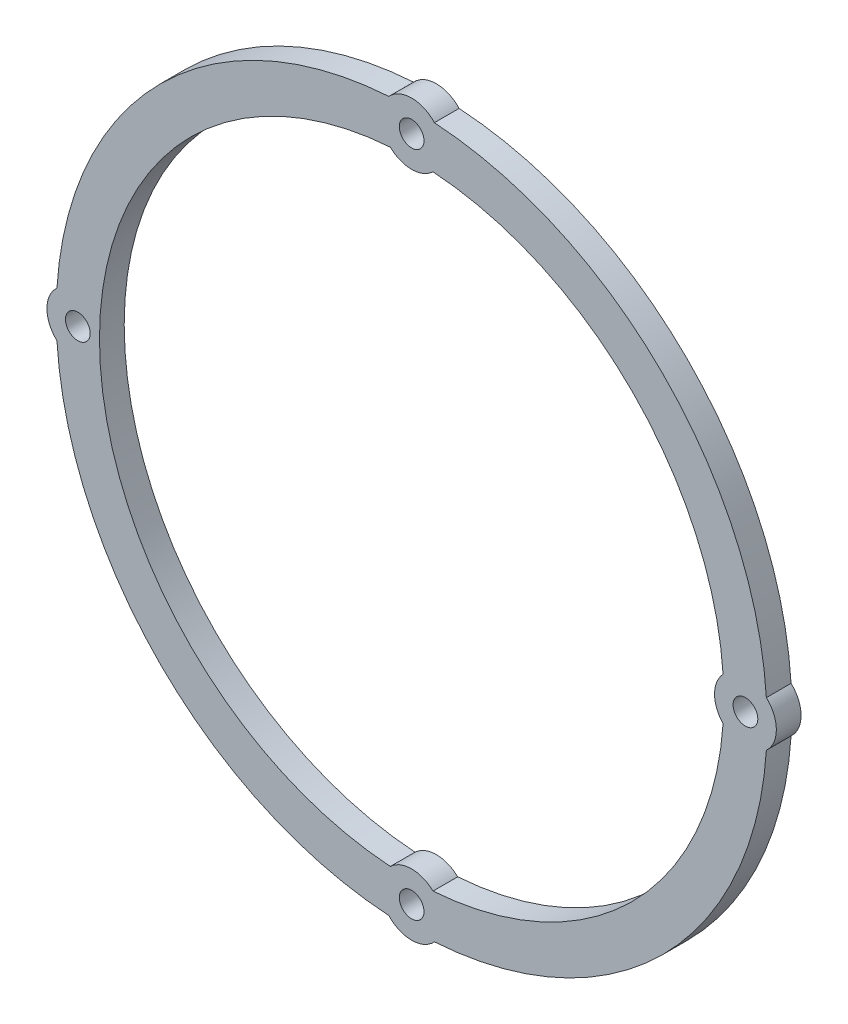
ISO-10303-21;
HEADER;
FILE_DESCRIPTION(('STEP AP214'),'2;1');
FILE_NAME('part.step','',(''),(''),'','','');
FILE_SCHEMA(('AUTOMOTIVE_DESIGN { 1 0 10303 214 1 1 1 1 }'));
ENDSEC;
DATA;
#1=APPLICATION_CONTEXT('core data for automotive mechanical design processes');
#2=APPLICATION_PROTOCOL_DEFINITION('international standard','automotive_design',2000,#1);
#3=PRODUCT_CONTEXT('',#1,'mechanical');
#4=PRODUCT('Part','Part','',(#3));
#5=PRODUCT_RELATED_PRODUCT_CATEGORY('part','',(#4));
#6=PRODUCT_DEFINITION_FORMATION('','',#4);
#7=PRODUCT_DEFINITION_CONTEXT('part definition',#1,'design');
#8=PRODUCT_DEFINITION('design','',#6,#7);
#9=PRODUCT_DEFINITION_SHAPE('','',#8);
#10=(LENGTH_UNIT() NAMED_UNIT(*) SI_UNIT(.MILLI.,.METRE.));
#11=(NAMED_UNIT(*) PLANE_ANGLE_UNIT() SI_UNIT($,.RADIAN.));
#12=(NAMED_UNIT(*) SI_UNIT($,.STERADIAN.) SOLID_ANGLE_UNIT());
#13=UNCERTAINTY_MEASURE_WITH_UNIT(LENGTH_MEASURE(1.E-05),#10,'distance_accuracy_value','');
#14=(GEOMETRIC_REPRESENTATION_CONTEXT(3) GLOBAL_UNCERTAINTY_ASSIGNED_CONTEXT((#13)) GLOBAL_UNIT_ASSIGNED_CONTEXT((#10,
#11,#12)) REPRESENTATION_CONTEXT('',''));
#15=CARTESIAN_POINT('',(0.,0.,0.));
#16=DIRECTION('',(0.,0.,1.));
#17=DIRECTION('',(1.,0.,0.));
#18=AXIS2_PLACEMENT_3D('',#15,#16,#17);
#19=CARTESIAN_POINT('',(54.0000000000002,0.,4.));
#20=DIRECTION('',(0.,0.,-1.));
#21=DIRECTION('',(-1.,0.,0.));
#22=AXIS2_PLACEMENT_3D('',#19,#20,#21);
#23=CYLINDRICAL_SURFACE('',#22,2.0000000000001);
#24=CARTESIAN_POINT('',(54.0000000000002,0.,4.));
#25=DIRECTION('',(0.,0.,1.));
#26=DIRECTION('',(1.,0.,0.));
#27=AXIS2_PLACEMENT_3D('',#24,#25,#26);
#28=CIRCLE('',#27,2.0000000000001);
#29=CARTESIAN_POINT('',(56.0000000000004,0.,4.));
#30=VERTEX_POINT('',#29);
#31=EDGE_CURVE('E232',#30,#30,#28,.T.);
#32=ORIENTED_EDGE('',*,*,#31,.T.);
#33=EDGE_LOOP('',(#32));
#34=FACE_BOUND('',#33,.T.);
#35=CARTESIAN_POINT('',(54.0000000000002,0.,0.));
#36=DIRECTION('',(0.,0.,1.));
#37=DIRECTION('',(1.,0.,0.));
#38=AXIS2_PLACEMENT_3D('',#35,#36,#37);
#39=CIRCLE('',#38,2.0000000000001);
#40=CARTESIAN_POINT('',(56.0000000000004,0.,0.));
#41=VERTEX_POINT('',#40);
#42=EDGE_CURVE('E281',#41,#41,#39,.T.);
#43=ORIENTED_EDGE('',*,*,#42,.F.);
#44=EDGE_LOOP('',(#43));
#45=FACE_BOUND('',#44,.T.);
#46=ADVANCED_FACE('F99',(#34,#45),#23,.F.);
#47=CARTESIAN_POINT('',(0.,0.,0.));
#48=DIRECTION('',(0.,0.,1.));
#49=DIRECTION('',(1.,0.,0.));
#50=AXIS2_PLACEMENT_3D('',#47,#48,#49);
#51=PLANE('',#50);
#52=CARTESIAN_POINT('',(0.,0.,0.));
#53=DIRECTION('',(0.,0.,1.));
#54=DIRECTION('',(1.,0.,0.));
#55=AXIS2_PLACEMENT_3D('',#52,#53,#54);
#56=CIRCLE('',#55,57.5);
#57=CARTESIAN_POINT('',(57.3819444444444,3.68272341816406,0.));
#58=VERTEX_POINT('',#57);
#59=CARTESIAN_POINT('',(3.68272341816371,57.3819444444444,0.));
#60=VERTEX_POINT('',#59);
#61=EDGE_CURVE('E256',#58,#60,#56,.T.);
#62=ORIENTED_EDGE('',*,*,#61,.F.);
#63=CARTESIAN_POINT('',(54.0000000000002,0.,0.));
#64=DIRECTION('',(0.,0.,1.));
#65=DIRECTION('',(1.,0.,0.));
#66=AXIS2_PLACEMENT_3D('',#63,#64,#65);
#67=CIRCLE('',#66,5.0000000000001);
#68=CARTESIAN_POINT('',(57.3819444444444,-3.68272341816407,0.));
#69=VERTEX_POINT('',#68);
#70=EDGE_CURVE('E253',#69,#58,#67,.T.);
#71=ORIENTED_EDGE('',*,*,#70,.F.);
#72=CARTESIAN_POINT('',(0.,0.,0.));
#73=DIRECTION('',(0.,0.,1.));
#74=DIRECTION('',(1.,0.,0.));
#75=AXIS2_PLACEMENT_3D('',#72,#73,#74);
#76=CIRCLE('',#75,57.5);
#77=CARTESIAN_POINT('',(3.68272341816331,-57.3819444444445,0.));
#78=VERTEX_POINT('',#77);
#79=EDGE_CURVE('E250',#78,#69,#76,.T.);
#80=ORIENTED_EDGE('',*,*,#79,.F.);
#81=CARTESIAN_POINT('',(-3.77079984595058E-13,-54.,0.));
#82=DIRECTION('',(0.,0.,1.));
#83=DIRECTION('',(1.,0.,0.));
#84=AXIS2_PLACEMENT_3D('',#81,#82,#83);
#85=CIRCLE('',#84,5.);
#86=CARTESIAN_POINT('',(-3.68272341816411,-57.3819444444444,0.));
#87=VERTEX_POINT('',#86);
#88=EDGE_CURVE('E248',#87,#78,#85,.T.);
#89=ORIENTED_EDGE('',*,*,#88,.F.);
#90=CARTESIAN_POINT('',(0.,0.,0.));
#91=DIRECTION('',(0.,0.,1.));
#92=DIRECTION('',(1.,0.,0.));
#93=AXIS2_PLACEMENT_3D('',#90,#91,#92);
#94=CIRCLE('',#93,57.5);
#95=CARTESIAN_POINT('',(-57.3819444444444,-3.6827234181637,0.));
#96=VERTEX_POINT('',#95);
#97=EDGE_CURVE('E245',#96,#87,#94,.T.);
#98=ORIENTED_EDGE('',*,*,#97,.F.);
#99=CARTESIAN_POINT('',(-54.,0.,0.));
#100=DIRECTION('',(0.,0.,1.));
#101=DIRECTION('',(1.,0.,0.));
#102=AXIS2_PLACEMENT_3D('',#99,#100,#101);
#103=CIRCLE('',#102,5.);
#104=CARTESIAN_POINT('',(-57.3819444444444,3.68272341816371,0.));
#105=VERTEX_POINT('',#104);
#106=EDGE_CURVE('E262',#105,#96,#103,.T.);
#107=ORIENTED_EDGE('',*,*,#106,.F.);
#108=CARTESIAN_POINT('',(0.,0.,0.));
#109=DIRECTION('',(0.,0.,1.));
#110=DIRECTION('',(1.,0.,0.));
#111=AXIS2_PLACEMENT_3D('',#108,#109,#110);
#112=CIRCLE('',#111,57.5);
#113=CARTESIAN_POINT('',(-3.68272341816371,57.3819444444444,0.));
#114=VERTEX_POINT('',#113);
#115=EDGE_CURVE('E260',#114,#105,#112,.T.);
#116=ORIENTED_EDGE('',*,*,#115,.F.);
#117=CARTESIAN_POINT('',(0.,54.,0.));
#118=DIRECTION('',(0.,0.,1.));
#119=DIRECTION('',(1.,0.,0.));
#120=AXIS2_PLACEMENT_3D('',#117,#118,#119);
#121=CIRCLE('',#120,5.);
#122=EDGE_CURVE('E258',#60,#114,#121,.T.);
#123=ORIENTED_EDGE('',*,*,#122,.F.);
#124=EDGE_LOOP('',(#62,#71,#80,#89,#98,#107,#116,#123));
#125=FACE_BOUND('',#124,.T.);
#126=CARTESIAN_POINT('',(54.0000000000002,0.,0.));
#127=DIRECTION('',(0.,0.,1.));
#128=DIRECTION('',(1.,0.,0.));
#129=AXIS2_PLACEMENT_3D('',#126,#127,#128);
#130=CIRCLE('',#129,5.0000000000001);
#131=CARTESIAN_POINT('',(50.3819444444444,3.45103955307867,0.));
#132=VERTEX_POINT('',#131);
#133=CARTESIAN_POINT('',(50.3819444444444,-3.45103955307868,0.));
#134=VERTEX_POINT('',#133);
#135=EDGE_CURVE('E279',#132,#134,#130,.T.);
#136=ORIENTED_EDGE('',*,*,#135,.F.);
#137=CARTESIAN_POINT('',(0.,0.,0.));
#138=DIRECTION('',(0.,0.,1.));
#139=DIRECTION('',(1.,0.,0.));
#140=AXIS2_PLACEMENT_3D('',#137,#138,#139);
#141=CIRCLE('',#140,50.5);
#142=CARTESIAN_POINT('',(3.45103955307874,50.3819444444444,0.));
#143=VERTEX_POINT('',#142);
#144=EDGE_CURVE('E277',#132,#143,#141,.T.);
#145=ORIENTED_EDGE('',*,*,#144,.T.);
#146=CARTESIAN_POINT('',(0.,54.,0.));
#147=DIRECTION('',(0.,0.,1.));
#148=DIRECTION('',(1.,0.,0.));
#149=AXIS2_PLACEMENT_3D('',#146,#147,#148);
#150=CIRCLE('',#149,5.);
#151=CARTESIAN_POINT('',(-3.45103955307874,50.3819444444444,0.));
#152=VERTEX_POINT('',#151);
#153=EDGE_CURVE('E223',#152,#143,#150,.T.);
#154=ORIENTED_EDGE('',*,*,#153,.F.);
#155=CARTESIAN_POINT('',(0.,0.,0.));
#156=DIRECTION('',(0.,0.,1.));
#157=DIRECTION('',(1.,0.,0.));
#158=AXIS2_PLACEMENT_3D('',#155,#156,#157);
#159=CIRCLE('',#158,50.5);
#160=CARTESIAN_POINT('',(-3.45103955307909,-50.3819444444444,0.));
#161=VERTEX_POINT('',#160);
#162=EDGE_CURVE('E273',#152,#161,#159,.T.);
#163=ORIENTED_EDGE('',*,*,#162,.T.);
#164=CARTESIAN_POINT('',(-3.77079984595058E-13,-54.,0.));
#165=DIRECTION('',(0.,0.,1.));
#166=DIRECTION('',(1.,0.,0.));
#167=AXIS2_PLACEMENT_3D('',#164,#165,#166);
#168=CIRCLE('',#167,5.);
#169=CARTESIAN_POINT('',(3.45103955307839,-50.3819444444445,0.));
#170=VERTEX_POINT('',#169);
#171=EDGE_CURVE('E270',#170,#161,#168,.T.);
#172=ORIENTED_EDGE('',*,*,#171,.F.);
#173=CARTESIAN_POINT('',(0.,0.,0.));
#174=DIRECTION('',(0.,0.,1.));
#175=DIRECTION('',(1.,0.,0.));
#176=AXIS2_PLACEMENT_3D('',#173,#174,#175);
#177=CIRCLE('',#176,50.5);
#178=EDGE_CURVE('E267',#170,#134,#177,.T.);
#179=ORIENTED_EDGE('',*,*,#178,.T.);
#180=EDGE_LOOP('',(#136,#145,#154,#163,#172,#179));
#181=FACE_BOUND('',#180,.T.);
#182=ORIENTED_EDGE('',*,*,#42,.T.);
#183=EDGE_LOOP('',(#182));
#184=FACE_BOUND('',#183,.T.);
#185=CARTESIAN_POINT('',(-3.77079984595058E-13,-54.,0.));
#186=DIRECTION('',(0.,0.,1.));
#187=DIRECTION('',(1.,0.,0.));
#188=AXIS2_PLACEMENT_3D('',#185,#186,#187);
#189=CIRCLE('',#188,2.);
#190=CARTESIAN_POINT('',(1.99999999999962,-54.,0.));
#191=VERTEX_POINT('',#190);
#192=EDGE_CURVE('E287',#191,#191,#189,.T.);
#193=ORIENTED_EDGE('',*,*,#192,.T.);
#194=EDGE_LOOP('',(#193));
#195=FACE_BOUND('',#194,.T.);
#196=CARTESIAN_POINT('',(-54.,0.,0.));
#197=DIRECTION('',(0.,0.,1.));
#198=DIRECTION('',(1.,0.,0.));
#199=AXIS2_PLACEMENT_3D('',#196,#197,#198);
#200=CIRCLE('',#199,2.00000000000053);
#201=CARTESIAN_POINT('',(-51.9999999999995,0.,0.));
#202=VERTEX_POINT('',#201);
#203=EDGE_CURVE('E284',#202,#202,#200,.T.);
#204=ORIENTED_EDGE('',*,*,#203,.T.);
#205=EDGE_LOOP('',(#204));
#206=FACE_BOUND('',#205,.T.);
#207=CARTESIAN_POINT('',(0.,54.,0.));
#208=DIRECTION('',(0.,0.,1.));
#209=DIRECTION('',(1.,0.,0.));
#210=AXIS2_PLACEMENT_3D('',#207,#208,#209);
#211=CIRCLE('',#210,2.);
#212=CARTESIAN_POINT('',(2.,54.,0.));
#213=VERTEX_POINT('',#212);
#214=EDGE_CURVE('E264',#213,#213,#211,.T.);
#215=ORIENTED_EDGE('',*,*,#214,.T.);
#216=EDGE_LOOP('',(#215));
#217=FACE_BOUND('',#216,.T.);
#218=ADVANCED_FACE('F323',(#125,#181,#184,#195,#206,#217),#51,.F.);
#219=CARTESIAN_POINT('',(54.0000000000002,0.,4.));
#220=DIRECTION('',(0.,0.,-1.));
#221=DIRECTION('',(-1.,0.,0.));
#222=AXIS2_PLACEMENT_3D('',#219,#220,#221);
#223=CYLINDRICAL_SURFACE('',#222,5.0000000000001);
#224=ORIENTED_EDGE('',*,*,#70,.T.);
#225=DIRECTION('',(0.,0.,-1.));
#226=VECTOR('',#225,1.);
#227=CARTESIAN_POINT('',(57.3819444444444,3.68272341816406,4.));
#228=LINE('',#227,#226);
#229=CARTESIAN_POINT('',(57.3819444444444,3.68272341816406,4.));
#230=VERTEX_POINT('',#229);
#231=EDGE_CURVE('E306',#230,#58,#228,.T.);
#232=ORIENTED_EDGE('',*,*,#231,.F.);
#233=CARTESIAN_POINT('',(54.0000000000002,0.,4.));
#234=DIRECTION('',(0.,0.,1.));
#235=DIRECTION('',(1.,0.,0.));
#236=AXIS2_PLACEMENT_3D('',#233,#234,#235);
#237=CIRCLE('',#236,5.0000000000001);
#238=CARTESIAN_POINT('',(57.3819444444444,-3.68272341816407,4.));
#239=VERTEX_POINT('',#238);
#240=EDGE_CURVE('E334',#239,#230,#237,.T.);
#241=ORIENTED_EDGE('',*,*,#240,.F.);
#242=DIRECTION('',(0.,0.,-1.));
#243=VECTOR('',#242,1.);
#244=CARTESIAN_POINT('',(57.3819444444444,-3.68272341816407,4.));
#245=LINE('',#244,#243);
#246=EDGE_CURVE('E308',#239,#69,#245,.T.);
#247=ORIENTED_EDGE('',*,*,#246,.T.);
#248=EDGE_LOOP('',(#224,#232,#241,#247));
#249=FACE_BOUND('',#248,.T.);
#250=ADVANCED_FACE('F337',(#249),#223,.T.);
#251=CARTESIAN_POINT('',(54.0000000000002,0.,4.));
#252=DIRECTION('',(0.,0.,-1.));
#253=DIRECTION('',(-1.,0.,0.));
#254=AXIS2_PLACEMENT_3D('',#251,#252,#253);
#255=CYLINDRICAL_SURFACE('',#254,5.0000000000001);
#256=ORIENTED_EDGE('',*,*,#135,.T.);
#257=DIRECTION('',(0.,0.,-1.));
#258=VECTOR('',#257,1.);
#259=CARTESIAN_POINT('',(50.3819444444444,-3.45103955307868,4.));
#260=LINE('',#259,#258);
#261=CARTESIAN_POINT('',(50.3819444444444,-3.45103955307868,4.));
#262=VERTEX_POINT('',#261);
#263=EDGE_CURVE('E118',#262,#134,#260,.T.);
#264=ORIENTED_EDGE('',*,*,#263,.F.);
#265=CARTESIAN_POINT('',(54.0000000000002,0.,4.));
#266=DIRECTION('',(0.,0.,1.));
#267=DIRECTION('',(1.,0.,0.));
#268=AXIS2_PLACEMENT_3D('',#265,#266,#267);
#269=CIRCLE('',#268,5.0000000000001);
#270=CARTESIAN_POINT('',(50.3819444444444,3.45103955307867,4.));
#271=VERTEX_POINT('',#270);
#272=EDGE_CURVE('E230',#271,#262,#269,.T.);
#273=ORIENTED_EDGE('',*,*,#272,.F.);
#274=DIRECTION('',(0.,0.,-1.));
#275=VECTOR('',#274,1.);
#276=CARTESIAN_POINT('',(50.3819444444444,3.45103955307867,4.));
#277=LINE('',#276,#275);
#278=EDGE_CURVE('E161',#271,#132,#277,.T.);
#279=ORIENTED_EDGE('',*,*,#278,.T.);
#280=EDGE_LOOP('',(#256,#264,#273,#279));
#281=FACE_BOUND('',#280,.T.);
#282=ADVANCED_FACE('F361',(#281),#255,.T.);
#283=CARTESIAN_POINT('',(0.,0.,4.));
#284=DIRECTION('',(0.,0.,1.));
#285=DIRECTION('',(1.,0.,0.));
#286=AXIS2_PLACEMENT_3D('',#283,#284,#285);
#287=PLANE('',#286);
#288=ORIENTED_EDGE('',*,*,#240,.T.);
#289=CARTESIAN_POINT('',(0.,0.,4.));
#290=DIRECTION('',(0.,0.,1.));
#291=DIRECTION('',(1.,0.,0.));
#292=AXIS2_PLACEMENT_3D('',#289,#290,#291);
#293=CIRCLE('',#292,57.5);
#294=CARTESIAN_POINT('',(3.68272341816371,57.3819444444444,4.));
#295=VERTEX_POINT('',#294);
#296=EDGE_CURVE('E338',#230,#295,#293,.T.);
#297=ORIENTED_EDGE('',*,*,#296,.T.);
#298=CARTESIAN_POINT('',(0.,54.,4.));
#299=DIRECTION('',(0.,0.,1.));
#300=DIRECTION('',(1.,0.,0.));
#301=AXIS2_PLACEMENT_3D('',#298,#299,#300);
#302=CIRCLE('',#301,5.);
#303=CARTESIAN_POINT('',(-3.68272341816371,57.3819444444444,4.));
#304=VERTEX_POINT('',#303);
#305=EDGE_CURVE('E340',#295,#304,#302,.T.);
#306=ORIENTED_EDGE('',*,*,#305,.T.);
#307=CARTESIAN_POINT('',(0.,0.,4.));
#308=DIRECTION('',(0.,0.,1.));
#309=DIRECTION('',(1.,0.,0.));
#310=AXIS2_PLACEMENT_3D('',#307,#308,#309);
#311=CIRCLE('',#310,57.5);
#312=CARTESIAN_POINT('',(-57.3819444444444,3.68272341816371,4.));
#313=VERTEX_POINT('',#312);
#314=EDGE_CURVE('E345',#304,#313,#311,.T.);
#315=ORIENTED_EDGE('',*,*,#314,.T.);
#316=CARTESIAN_POINT('',(-54.,0.,4.));
#317=DIRECTION('',(0.,0.,1.));
#318=DIRECTION('',(1.,0.,0.));
#319=AXIS2_PLACEMENT_3D('',#316,#317,#318);
#320=CIRCLE('',#319,5.);
#321=CARTESIAN_POINT('',(-57.3819444444444,-3.6827234181637,4.));
#322=VERTEX_POINT('',#321);
#323=EDGE_CURVE('E347',#313,#322,#320,.T.);
#324=ORIENTED_EDGE('',*,*,#323,.T.);
#325=CARTESIAN_POINT('',(0.,0.,4.));
#326=DIRECTION('',(0.,0.,1.));
#327=DIRECTION('',(1.,0.,0.));
#328=AXIS2_PLACEMENT_3D('',#325,#326,#327);
#329=CIRCLE('',#328,57.5);
#330=CARTESIAN_POINT('',(-3.68272341816411,-57.3819444444444,4.));
#331=VERTEX_POINT('',#330);
#332=EDGE_CURVE('E290',#322,#331,#329,.T.);
#333=ORIENTED_EDGE('',*,*,#332,.T.);
#334=CARTESIAN_POINT('',(-3.77079984595058E-13,-54.,4.));
#335=DIRECTION('',(0.,0.,1.));
#336=DIRECTION('',(1.,0.,0.));
#337=AXIS2_PLACEMENT_3D('',#334,#335,#336);
#338=CIRCLE('',#337,5.);
#339=CARTESIAN_POINT('',(3.68272341816331,-57.3819444444445,4.));
#340=VERTEX_POINT('',#339);
#341=EDGE_CURVE('E174',#331,#340,#338,.T.);
#342=ORIENTED_EDGE('',*,*,#341,.T.);
#343=CARTESIAN_POINT('',(0.,0.,4.));
#344=DIRECTION('',(0.,0.,1.));
#345=DIRECTION('',(1.,0.,0.));
#346=AXIS2_PLACEMENT_3D('',#343,#344,#345);
#347=CIRCLE('',#346,57.5);
#348=EDGE_CURVE('E329',#340,#239,#347,.T.);
#349=ORIENTED_EDGE('',*,*,#348,.T.);
#350=EDGE_LOOP('',(#288,#297,#306,#315,#324,#333,#342,#349));
#351=FACE_BOUND('',#350,.T.);
#352=ORIENTED_EDGE('',*,*,#272,.T.);
#353=CARTESIAN_POINT('',(0.,0.,4.));
#354=DIRECTION('',(0.,0.,1.));
#355=DIRECTION('',(1.,0.,0.));
#356=AXIS2_PLACEMENT_3D('',#353,#354,#355);
#357=CIRCLE('',#356,50.5);
#358=CARTESIAN_POINT('',(3.45103955307839,-50.3819444444445,4.));
#359=VERTEX_POINT('',#358);
#360=EDGE_CURVE('E352',#359,#262,#357,.T.);
#361=ORIENTED_EDGE('',*,*,#360,.F.);
#362=CARTESIAN_POINT('',(-3.77079984595058E-13,-54.,4.));
#363=DIRECTION('',(0.,0.,1.));
#364=DIRECTION('',(1.,0.,0.));
#365=AXIS2_PLACEMENT_3D('',#362,#363,#364);
#366=CIRCLE('',#365,5.);
#367=CARTESIAN_POINT('',(-3.45103955307909,-50.3819444444444,4.));
#368=VERTEX_POINT('',#367);
#369=EDGE_CURVE('E354',#359,#368,#366,.T.);
#370=ORIENTED_EDGE('',*,*,#369,.T.);
#371=CARTESIAN_POINT('',(0.,0.,4.));
#372=DIRECTION('',(0.,0.,1.));
#373=DIRECTION('',(1.,0.,0.));
#374=AXIS2_PLACEMENT_3D('',#371,#372,#373);
#375=CIRCLE('',#374,50.5);
#376=CARTESIAN_POINT('',(-3.45103955307874,50.3819444444444,4.));
#377=VERTEX_POINT('',#376);
#378=EDGE_CURVE('E216',#377,#368,#375,.T.);
#379=ORIENTED_EDGE('',*,*,#378,.F.);
#380=CARTESIAN_POINT('',(0.,54.,4.));
#381=DIRECTION('',(0.,0.,1.));
#382=DIRECTION('',(1.,0.,0.));
#383=AXIS2_PLACEMENT_3D('',#380,#381,#382);
#384=CIRCLE('',#383,5.);
#385=CARTESIAN_POINT('',(3.45103955307874,50.3819444444444,4.));
#386=VERTEX_POINT('',#385);
#387=EDGE_CURVE('E209',#377,#386,#384,.T.);
#388=ORIENTED_EDGE('',*,*,#387,.T.);
#389=CARTESIAN_POINT('',(0.,0.,4.));
#390=DIRECTION('',(0.,0.,1.));
#391=DIRECTION('',(1.,0.,0.));
#392=AXIS2_PLACEMENT_3D('',#389,#390,#391);
#393=CIRCLE('',#392,50.5);
#394=EDGE_CURVE('E214',#271,#386,#393,.T.);
#395=ORIENTED_EDGE('',*,*,#394,.F.);
#396=EDGE_LOOP('',(#352,#361,#370,#379,#388,#395));
#397=FACE_BOUND('',#396,.T.);
#398=ORIENTED_EDGE('',*,*,#31,.F.);
#399=EDGE_LOOP('',(#398));
#400=FACE_BOUND('',#399,.T.);
#401=CARTESIAN_POINT('',(-3.77079984595058E-13,-54.,4.));
#402=DIRECTION('',(0.,0.,1.));
#403=DIRECTION('',(1.,0.,0.));
#404=AXIS2_PLACEMENT_3D('',#401,#402,#403);
#405=CIRCLE('',#404,2.);
#406=CARTESIAN_POINT('',(1.99999999999962,-54.,4.));
#407=VERTEX_POINT('',#406);
#408=EDGE_CURVE('E241',#407,#407,#405,.T.);
#409=ORIENTED_EDGE('',*,*,#408,.F.);
#410=EDGE_LOOP('',(#409));
#411=FACE_BOUND('',#410,.T.);
#412=CARTESIAN_POINT('',(-54.,0.,4.));
#413=DIRECTION('',(0.,0.,1.));
#414=DIRECTION('',(1.,0.,0.));
#415=AXIS2_PLACEMENT_3D('',#412,#413,#414);
#416=CIRCLE('',#415,2.00000000000053);
#417=CARTESIAN_POINT('',(-51.9999999999995,0.,4.));
#418=VERTEX_POINT('',#417);
#419=EDGE_CURVE('E238',#418,#418,#416,.T.);
#420=ORIENTED_EDGE('',*,*,#419,.F.);
#421=EDGE_LOOP('',(#420));
#422=FACE_BOUND('',#421,.T.);
#423=CARTESIAN_POINT('',(0.,54.,4.));
#424=DIRECTION('',(0.,0.,1.));
#425=DIRECTION('',(1.,0.,0.));
#426=AXIS2_PLACEMENT_3D('',#423,#424,#425);
#427=CIRCLE('',#426,2.);
#428=CARTESIAN_POINT('',(2.,54.,4.));
#429=VERTEX_POINT('',#428);
#430=EDGE_CURVE('E349',#429,#429,#427,.T.);
#431=ORIENTED_EDGE('',*,*,#430,.F.);
#432=EDGE_LOOP('',(#431));
#433=FACE_BOUND('',#432,.T.);
#434=ADVANCED_FACE('F211',(#351,#397,#400,#411,#422,#433),#287,.T.);
#435=CARTESIAN_POINT('',(0.,0.,4.));
#436=DIRECTION('',(0.,0.,-1.));
#437=DIRECTION('',(-1.,0.,0.));
#438=AXIS2_PLACEMENT_3D('',#435,#436,#437);
#439=CYLINDRICAL_SURFACE('',#438,50.5);
#440=ORIENTED_EDGE('',*,*,#178,.F.);
#441=DIRECTION('',(0.,0.,-1.));
#442=VECTOR('',#441,1.);
#443=CARTESIAN_POINT('',(3.45103955307839,-50.3819444444445,4.));
#444=LINE('',#443,#442);
#445=EDGE_CURVE('E12',#359,#170,#444,.T.);
#446=ORIENTED_EDGE('',*,*,#445,.F.);
#447=ORIENTED_EDGE('',*,*,#360,.T.);
#448=ORIENTED_EDGE('',*,*,#263,.T.);
#449=EDGE_LOOP('',(#440,#446,#447,#448));
#450=FACE_BOUND('',#449,.T.);
#451=ADVANCED_FACE('F369',(#450),#439,.F.);
#452=CARTESIAN_POINT('',(-3.77079984595058E-13,-54.,4.));
#453=DIRECTION('',(0.,0.,-1.));
#454=DIRECTION('',(-1.,0.,0.));
#455=AXIS2_PLACEMENT_3D('',#452,#453,#454);
#456=CYLINDRICAL_SURFACE('',#455,5.);
#457=ORIENTED_EDGE('',*,*,#171,.T.);
#458=DIRECTION('',(0.,0.,-1.));
#459=VECTOR('',#458,1.);
#460=CARTESIAN_POINT('',(-3.45103955307909,-50.3819444444444,4.));
#461=LINE('',#460,#459);
#462=EDGE_CURVE('E109',#368,#161,#461,.T.);
#463=ORIENTED_EDGE('',*,*,#462,.F.);
#464=ORIENTED_EDGE('',*,*,#369,.F.);
#465=ORIENTED_EDGE('',*,*,#445,.T.);
#466=EDGE_LOOP('',(#457,#463,#464,#465));
#467=FACE_BOUND('',#466,.T.);
#468=ADVANCED_FACE('F464',(#467),#456,.T.);
#469=CARTESIAN_POINT('',(0.,0.,4.));
#470=DIRECTION('',(0.,0.,-1.));
#471=DIRECTION('',(-1.,0.,0.));
#472=AXIS2_PLACEMENT_3D('',#469,#470,#471);
#473=CYLINDRICAL_SURFACE('',#472,50.5);
#474=ORIENTED_EDGE('',*,*,#162,.F.);
#475=DIRECTION('',(0.,0.,-1.));
#476=VECTOR('',#475,1.);
#477=CARTESIAN_POINT('',(-3.45103955307874,50.3819444444444,4.));
#478=LINE('',#477,#476);
#479=EDGE_CURVE('E227',#377,#152,#478,.T.);
#480=ORIENTED_EDGE('',*,*,#479,.F.);
#481=ORIENTED_EDGE('',*,*,#378,.T.);
#482=ORIENTED_EDGE('',*,*,#462,.T.);
#483=EDGE_LOOP('',(#474,#480,#481,#482));
#484=FACE_BOUND('',#483,.T.);
#485=ADVANCED_FACE('F357',(#484),#473,.F.);
#486=CARTESIAN_POINT('',(0.,54.,4.));
#487=DIRECTION('',(0.,0.,-1.));
#488=DIRECTION('',(-1.,0.,0.));
#489=AXIS2_PLACEMENT_3D('',#486,#487,#488);
#490=CYLINDRICAL_SURFACE('',#489,5.);
#491=ORIENTED_EDGE('',*,*,#153,.T.);
#492=DIRECTION('',(0.,0.,-1.));
#493=VECTOR('',#492,1.);
#494=CARTESIAN_POINT('',(3.45103955307874,50.3819444444444,4.));
#495=LINE('',#494,#493);
#496=EDGE_CURVE('E220',#386,#143,#495,.T.);
#497=ORIENTED_EDGE('',*,*,#496,.F.);
#498=ORIENTED_EDGE('',*,*,#387,.F.);
#499=ORIENTED_EDGE('',*,*,#479,.T.);
#500=EDGE_LOOP('',(#491,#497,#498,#499));
#501=FACE_BOUND('',#500,.T.);
#502=ADVANCED_FACE('F221',(#501),#490,.T.);
#503=CARTESIAN_POINT('',(0.,0.,4.));
#504=DIRECTION('',(0.,0.,-1.));
#505=DIRECTION('',(-1.,0.,0.));
#506=AXIS2_PLACEMENT_3D('',#503,#504,#505);
#507=CYLINDRICAL_SURFACE('',#506,50.5);
#508=ORIENTED_EDGE('',*,*,#144,.F.);
#509=ORIENTED_EDGE('',*,*,#278,.F.);
#510=ORIENTED_EDGE('',*,*,#394,.T.);
#511=ORIENTED_EDGE('',*,*,#496,.T.);
#512=EDGE_LOOP('',(#508,#509,#510,#511));
#513=FACE_BOUND('',#512,.T.);
#514=ADVANCED_FACE('F229',(#513),#507,.F.);
#515=CARTESIAN_POINT('',(0.,0.,4.));
#516=DIRECTION('',(0.,0.,-1.));
#517=DIRECTION('',(-1.,0.,0.));
#518=AXIS2_PLACEMENT_3D('',#515,#516,#517);
#519=CYLINDRICAL_SURFACE('',#518,57.5);
#520=ORIENTED_EDGE('',*,*,#61,.T.);
#521=DIRECTION('',(0.,0.,-1.));
#522=VECTOR('',#521,1.);
#523=CARTESIAN_POINT('',(3.68272341816371,57.3819444444444,4.));
#524=LINE('',#523,#522);
#525=EDGE_CURVE('E303',#295,#60,#524,.T.);
#526=ORIENTED_EDGE('',*,*,#525,.F.);
#527=ORIENTED_EDGE('',*,*,#296,.F.);
#528=ORIENTED_EDGE('',*,*,#231,.T.);
#529=EDGE_LOOP('',(#520,#526,#527,#528));
#530=FACE_BOUND('',#529,.T.);
#531=ADVANCED_FACE('F421',(#530),#519,.T.);
#532=CARTESIAN_POINT('',(0.,54.,4.));
#533=DIRECTION('',(0.,0.,-1.));
#534=DIRECTION('',(-1.,0.,0.));
#535=AXIS2_PLACEMENT_3D('',#532,#533,#534);
#536=CYLINDRICAL_SURFACE('',#535,5.);
#537=ORIENTED_EDGE('',*,*,#122,.T.);
#538=DIRECTION('',(0.,0.,-1.));
#539=VECTOR('',#538,1.);
#540=CARTESIAN_POINT('',(-3.68272341816371,57.3819444444444,4.));
#541=LINE('',#540,#539);
#542=EDGE_CURVE('E300',#304,#114,#541,.T.);
#543=ORIENTED_EDGE('',*,*,#542,.F.);
#544=ORIENTED_EDGE('',*,*,#305,.F.);
#545=ORIENTED_EDGE('',*,*,#525,.T.);
#546=EDGE_LOOP('',(#537,#543,#544,#545));
#547=FACE_BOUND('',#546,.T.);
#548=ADVANCED_FACE('F417',(#547),#536,.T.);
#549=CARTESIAN_POINT('',(0.,0.,4.));
#550=DIRECTION('',(0.,0.,-1.));
#551=DIRECTION('',(-1.,0.,0.));
#552=AXIS2_PLACEMENT_3D('',#549,#550,#551);
#553=CYLINDRICAL_SURFACE('',#552,57.5);
#554=ORIENTED_EDGE('',*,*,#115,.T.);
#555=DIRECTION('',(0.,0.,-1.));
#556=VECTOR('',#555,1.);
#557=CARTESIAN_POINT('',(-57.3819444444444,3.68272341816371,4.));
#558=LINE('',#557,#556);
#559=EDGE_CURVE('E297',#313,#105,#558,.T.);
#560=ORIENTED_EDGE('',*,*,#559,.F.);
#561=ORIENTED_EDGE('',*,*,#314,.F.);
#562=ORIENTED_EDGE('',*,*,#542,.T.);
#563=EDGE_LOOP('',(#554,#560,#561,#562));
#564=FACE_BOUND('',#563,.T.);
#565=ADVANCED_FACE('F413',(#564),#553,.T.);
#566=CARTESIAN_POINT('',(-54.,0.,4.));
#567=DIRECTION('',(0.,0.,-1.));
#568=DIRECTION('',(-1.,0.,0.));
#569=AXIS2_PLACEMENT_3D('',#566,#567,#568);
#570=CYLINDRICAL_SURFACE('',#569,5.);
#571=ORIENTED_EDGE('',*,*,#106,.T.);
#572=DIRECTION('',(0.,0.,-1.));
#573=VECTOR('',#572,1.);
#574=CARTESIAN_POINT('',(-57.3819444444444,-3.6827234181637,4.));
#575=LINE('',#574,#573);
#576=EDGE_CURVE('E244',#322,#96,#575,.T.);
#577=ORIENTED_EDGE('',*,*,#576,.F.);
#578=ORIENTED_EDGE('',*,*,#323,.F.);
#579=ORIENTED_EDGE('',*,*,#559,.T.);
#580=EDGE_LOOP('',(#571,#577,#578,#579));
#581=FACE_BOUND('',#580,.T.);
#582=ADVANCED_FACE('F410',(#581),#570,.T.);
#583=CARTESIAN_POINT('',(0.,0.,4.));
#584=DIRECTION('',(0.,0.,-1.));
#585=DIRECTION('',(-1.,0.,0.));
#586=AXIS2_PLACEMENT_3D('',#583,#584,#585);
#587=CYLINDRICAL_SURFACE('',#586,57.5);
#588=ORIENTED_EDGE('',*,*,#97,.T.);
#589=DIRECTION('',(0.,0.,-1.));
#590=VECTOR('',#589,1.);
#591=CARTESIAN_POINT('',(-3.68272341816411,-57.3819444444444,4.));
#592=LINE('',#591,#590);
#593=EDGE_CURVE('E103',#331,#87,#592,.T.);
#594=ORIENTED_EDGE('',*,*,#593,.F.);
#595=ORIENTED_EDGE('',*,*,#332,.F.);
#596=ORIENTED_EDGE('',*,*,#576,.T.);
#597=EDGE_LOOP('',(#588,#594,#595,#596));
#598=FACE_BOUND('',#597,.T.);
#599=ADVANCED_FACE('F101',(#598),#587,.T.);
#600=CARTESIAN_POINT('',(-3.77079984595058E-13,-54.,4.));
#601=DIRECTION('',(0.,0.,-1.));
#602=DIRECTION('',(-1.,0.,0.));
#603=AXIS2_PLACEMENT_3D('',#600,#601,#602);
#604=CYLINDRICAL_SURFACE('',#603,5.);
#605=ORIENTED_EDGE('',*,*,#88,.T.);
#606=DIRECTION('',(0.,0.,-1.));
#607=VECTOR('',#606,1.);
#608=CARTESIAN_POINT('',(3.68272341816331,-57.3819444444445,4.));
#609=LINE('',#608,#607);
#610=EDGE_CURVE('E309',#340,#78,#609,.T.);
#611=ORIENTED_EDGE('',*,*,#610,.F.);
#612=ORIENTED_EDGE('',*,*,#341,.F.);
#613=ORIENTED_EDGE('',*,*,#593,.T.);
#614=EDGE_LOOP('',(#605,#611,#612,#613));
#615=FACE_BOUND('',#614,.T.);
#616=ADVANCED_FACE('F315',(#615),#604,.T.);
#617=CARTESIAN_POINT('',(0.,0.,4.));
#618=DIRECTION('',(0.,0.,-1.));
#619=DIRECTION('',(-1.,0.,0.));
#620=AXIS2_PLACEMENT_3D('',#617,#618,#619);
#621=CYLINDRICAL_SURFACE('',#620,57.5);
#622=ORIENTED_EDGE('',*,*,#79,.T.);
#623=ORIENTED_EDGE('',*,*,#246,.F.);
#624=ORIENTED_EDGE('',*,*,#348,.F.);
#625=ORIENTED_EDGE('',*,*,#610,.T.);
#626=EDGE_LOOP('',(#622,#623,#624,#625));
#627=FACE_BOUND('',#626,.T.);
#628=ADVANCED_FACE('F327',(#627),#621,.T.);
#629=CARTESIAN_POINT('',(0.,54.,4.));
#630=DIRECTION('',(0.,0.,-1.));
#631=DIRECTION('',(-1.,0.,0.));
#632=AXIS2_PLACEMENT_3D('',#629,#630,#631);
#633=CYLINDRICAL_SURFACE('',#632,2.);
#634=ORIENTED_EDGE('',*,*,#430,.T.);
#635=EDGE_LOOP('',(#634));
#636=FACE_BOUND('',#635,.T.);
#637=ORIENTED_EDGE('',*,*,#214,.F.);
#638=EDGE_LOOP('',(#637));
#639=FACE_BOUND('',#638,.T.);
#640=ADVANCED_FACE('F386',(#636,#639),#633,.F.);
#641=CARTESIAN_POINT('',(-54.,0.,4.));
#642=DIRECTION('',(0.,0.,-1.));
#643=DIRECTION('',(-1.,0.,0.));
#644=AXIS2_PLACEMENT_3D('',#641,#642,#643);
#645=CYLINDRICAL_SURFACE('',#644,2.00000000000053);
#646=ORIENTED_EDGE('',*,*,#419,.T.);
#647=EDGE_LOOP('',(#646));
#648=FACE_BOUND('',#647,.T.);
#649=ORIENTED_EDGE('',*,*,#203,.F.);
#650=EDGE_LOOP('',(#649));
#651=FACE_BOUND('',#650,.T.);
#652=ADVANCED_FACE('F375',(#648,#651),#645,.F.);
#653=CARTESIAN_POINT('',(-3.77079984595058E-13,-54.,4.));
#654=DIRECTION('',(0.,0.,-1.));
#655=DIRECTION('',(-1.,0.,0.));
#656=AXIS2_PLACEMENT_3D('',#653,#654,#655);
#657=CYLINDRICAL_SURFACE('',#656,2.);
#658=ORIENTED_EDGE('',*,*,#408,.T.);
#659=EDGE_LOOP('',(#658));
#660=FACE_BOUND('',#659,.T.);
#661=ORIENTED_EDGE('',*,*,#192,.F.);
#662=EDGE_LOOP('',(#661));
#663=FACE_BOUND('',#662,.T.);
#664=ADVANCED_FACE('F364',(#660,#663),#657,.F.);
#665=CLOSED_SHELL('',(#46,#218,#250,#282,#434,#451,#468,#485,#502,#514,#531,#548,#565,#582,#599,
#616,#628,#640,#652,#664));
#666=MANIFOLD_SOLID_BREP('B2',#665);
#667=ADVANCED_BREP_SHAPE_REPRESENTATION('',(#18,#666),#14);
#668=SHAPE_DEFINITION_REPRESENTATION(#9,#667);
ENDSEC;
END-ISO-10303-21;
